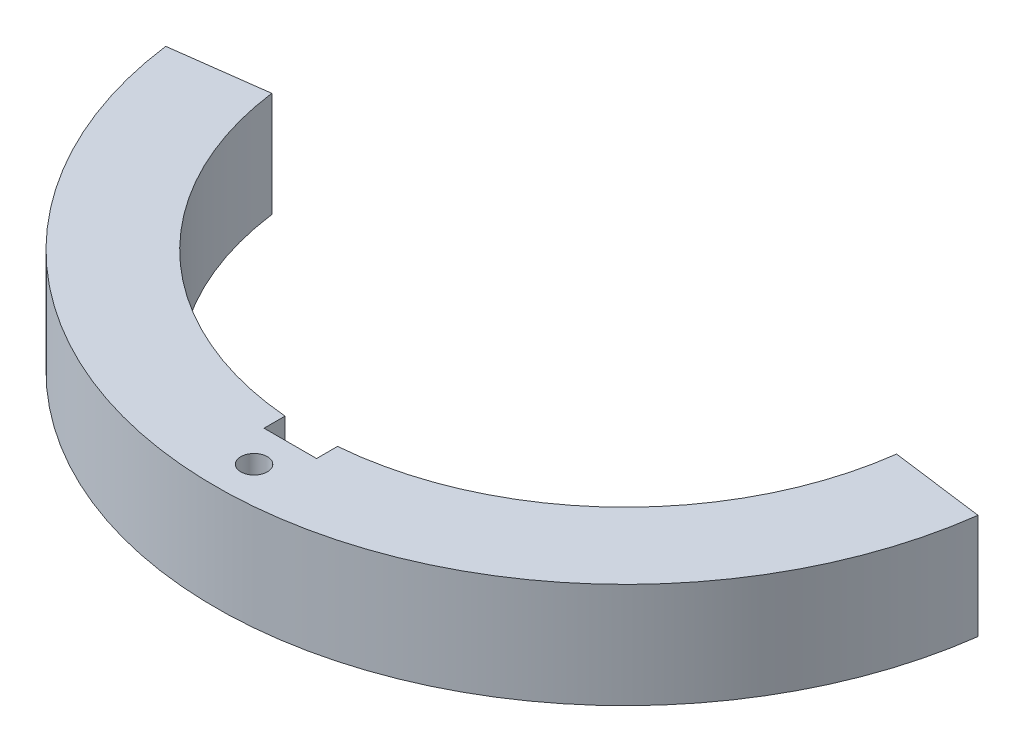
ISO-10303-21;
HEADER;
FILE_DESCRIPTION(('STEP AP214'),'2;1');
FILE_NAME('part.step','',(''),(''),'','','');
FILE_SCHEMA(('AUTOMOTIVE_DESIGN { 1 0 10303 214 1 1 1 1 }'));
ENDSEC;
DATA;
#1=APPLICATION_CONTEXT('core data for automotive mechanical design processes');
#2=APPLICATION_PROTOCOL_DEFINITION('international standard','automotive_design',2000,#1);
#3=PRODUCT_CONTEXT('',#1,'mechanical');
#4=PRODUCT('Part','Part','',(#3));
#5=PRODUCT_RELATED_PRODUCT_CATEGORY('part','',(#4));
#6=PRODUCT_DEFINITION_FORMATION('','',#4);
#7=PRODUCT_DEFINITION_CONTEXT('part definition',#1,'design');
#8=PRODUCT_DEFINITION('design','',#6,#7);
#9=PRODUCT_DEFINITION_SHAPE('','',#8);
#10=(LENGTH_UNIT() NAMED_UNIT(*) SI_UNIT(.MILLI.,.METRE.));
#11=(NAMED_UNIT(*) PLANE_ANGLE_UNIT() SI_UNIT($,.RADIAN.));
#12=(NAMED_UNIT(*) SI_UNIT($,.STERADIAN.) SOLID_ANGLE_UNIT());
#13=UNCERTAINTY_MEASURE_WITH_UNIT(LENGTH_MEASURE(1.E-05),#10,'distance_accuracy_value','');
#14=(GEOMETRIC_REPRESENTATION_CONTEXT(3) GLOBAL_UNCERTAINTY_ASSIGNED_CONTEXT((#13)) GLOBAL_UNIT_ASSIGNED_CONTEXT((#10,
#11,#12)) REPRESENTATION_CONTEXT('',''));
#15=CARTESIAN_POINT('',(0.,0.,0.));
#16=DIRECTION('',(0.,0.,1.));
#17=DIRECTION('',(1.,0.,0.));
#18=AXIS2_PLACEMENT_3D('',#15,#16,#17);
#19=CARTESIAN_POINT('',(0.,12.7,0.));
#20=DIRECTION('',(0.,1.,0.));
#21=DIRECTION('',(0.,0.,1.));
#22=AXIS2_PLACEMENT_3D('',#19,#20,#21);
#23=PLANE('',#22);
#24=CARTESIAN_POINT('',(0.,12.7,44.8850107430872));
#25=DIRECTION('',(0.,1.,0.));
#26=DIRECTION('',(0.,0.,1.));
#27=AXIS2_PLACEMENT_3D('',#24,#25,#26);
#28=CIRCLE('',#27,1.6);
#29=CARTESIAN_POINT('',(0.,12.7,46.4850107430871));
#30=VERTEX_POINT('',#29);
#31=EDGE_CURVE('E196',#30,#30,#28,.T.);
#32=ORIENTED_EDGE('',*,*,#31,.F.);
#33=EDGE_LOOP('',(#32));
#34=FACE_BOUND('',#33,.T.);
#35=DIRECTION('',(0.,0.,-1.));
#36=VECTOR('',#35,1.);
#37=CARTESIAN_POINT('',(3.175,12.7,40.5074778593469));
#38=LINE('',#37,#36);
#39=CARTESIAN_POINT('',(3.175,12.7,40.5074778593469));
#40=VERTEX_POINT('',#39);
#41=CARTESIAN_POINT('',(3.175,12.7,37.9674778593469));
#42=VERTEX_POINT('',#41);
#43=EDGE_CURVE('E144',#40,#42,#38,.T.);
#44=ORIENTED_EDGE('',*,*,#43,.F.);
#45=DIRECTION('',(1.,0.,0.));
#46=VECTOR('',#45,1.);
#47=CARTESIAN_POINT('',(3.175,12.7,40.5074778593469));
#48=LINE('',#47,#46);
#49=CARTESIAN_POINT('',(-3.175,12.7,40.5074778593469));
#50=VERTEX_POINT('',#49);
#51=EDGE_CURVE('E169',#50,#40,#48,.T.);
#52=ORIENTED_EDGE('',*,*,#51,.F.);
#53=DIRECTION('',(0.,0.,-1.));
#54=VECTOR('',#53,1.);
#55=CARTESIAN_POINT('',(-3.175,12.7,40.5074778593469));
#56=LINE('',#55,#54);
#57=CARTESIAN_POINT('',(-3.175,12.7,37.9674778593469));
#58=VERTEX_POINT('',#57);
#59=EDGE_CURVE('E166',#50,#58,#56,.T.);
#60=ORIENTED_EDGE('',*,*,#59,.T.);
#61=CARTESIAN_POINT('',(0.,12.7,0.));
#62=DIRECTION('',(0.,1.,0.));
#63=DIRECTION('',(0.,0.,1.));
#64=AXIS2_PLACEMENT_3D('',#61,#62,#63);
#65=CIRCLE('',#64,38.1);
#66=CARTESIAN_POINT('',(-37.7740492183422,12.7,4.97304792358401));
#67=VERTEX_POINT('',#66);
#68=EDGE_CURVE('E133',#67,#58,#65,.T.);
#69=ORIENTED_EDGE('',*,*,#68,.F.);
#70=DIRECTION('',(-0.99144486137381,0.,0.130526192220053));
#71=VECTOR('',#70,1.);
#72=CARTESIAN_POINT('',(0.,12.7,0.));
#73=LINE('',#72,#71);
#74=CARTESIAN_POINT('',(-49.1062639838448,12.7,6.46496230065921));
#75=VERTEX_POINT('',#74);
#76=EDGE_CURVE('E128',#67,#75,#73,.T.);
#77=ORIENTED_EDGE('',*,*,#76,.T.);
#78=CARTESIAN_POINT('',(0.,12.7,0.));
#79=DIRECTION('',(0.,1.,0.));
#80=DIRECTION('',(0.,0.,1.));
#81=AXIS2_PLACEMENT_3D('',#78,#79,#80);
#82=CIRCLE('',#81,49.53);
#83=CARTESIAN_POINT('',(49.1062639838448,12.7,6.46496230065918));
#84=VERTEX_POINT('',#83);
#85=EDGE_CURVE('E122',#75,#84,#82,.T.);
#86=ORIENTED_EDGE('',*,*,#85,.T.);
#87=DIRECTION('',(0.99144486137381,0.,0.130526192220053));
#88=VECTOR('',#87,1.);
#89=CARTESIAN_POINT('',(0.,12.7,0.));
#90=LINE('',#89,#88);
#91=CARTESIAN_POINT('',(37.7740492183422,12.7,4.97304792358398));
#92=VERTEX_POINT('',#91);
#93=EDGE_CURVE('E96',#92,#84,#90,.T.);
#94=ORIENTED_EDGE('',*,*,#93,.F.);
#95=EDGE_CURVE('E106',#42,#92,#65,.T.);
#96=ORIENTED_EDGE('',*,*,#95,.F.);
#97=EDGE_LOOP('',(#44,#52,#60,#69,#77,#86,#94,#96));
#98=FACE_BOUND('',#97,.T.);
#99=ADVANCED_FACE('F39',(#34,#98),#23,.T.);
#100=CARTESIAN_POINT('',(0.,0.,0.));
#101=DIRECTION('',(0.,1.,0.));
#102=DIRECTION('',(0.,0.,1.));
#103=AXIS2_PLACEMENT_3D('',#100,#101,#102);
#104=PLANE('',#103);
#105=DIRECTION('',(-1.,0.,0.));
#106=VECTOR('',#105,1.);
#107=CARTESIAN_POINT('',(3.175,0.,40.5074778593469));
#108=LINE('',#107,#106);
#109=CARTESIAN_POINT('',(3.175,0.,40.5074778593469));
#110=VERTEX_POINT('',#109);
#111=CARTESIAN_POINT('',(-3.175,0.,40.5074778593469));
#112=VERTEX_POINT('',#111);
#113=EDGE_CURVE('E186',#110,#112,#108,.T.);
#114=ORIENTED_EDGE('',*,*,#113,.F.);
#115=DIRECTION('',(0.,0.,-1.));
#116=VECTOR('',#115,1.);
#117=CARTESIAN_POINT('',(3.175,0.,40.5074778593469));
#118=LINE('',#117,#116);
#119=CARTESIAN_POINT('',(3.175,0.,37.9674778593469));
#120=VERTEX_POINT('',#119);
#121=EDGE_CURVE('E114',#110,#120,#118,.T.);
#122=ORIENTED_EDGE('',*,*,#121,.T.);
#123=CARTESIAN_POINT('',(0.,0.,0.));
#124=DIRECTION('',(0.,1.,0.));
#125=DIRECTION('',(0.,0.,1.));
#126=AXIS2_PLACEMENT_3D('',#123,#124,#125);
#127=CIRCLE('',#126,38.1);
#128=CARTESIAN_POINT('',(37.7740492183422,0.,4.97304792358398));
#129=VERTEX_POINT('',#128);
#130=EDGE_CURVE('E43',#120,#129,#127,.T.);
#131=ORIENTED_EDGE('',*,*,#130,.T.);
#132=DIRECTION('',(-0.99144486137381,0.,-0.130526192220053));
#133=VECTOR('',#132,1.);
#134=CARTESIAN_POINT('',(0.,0.,0.));
#135=LINE('',#134,#133);
#136=CARTESIAN_POINT('',(49.1062639838448,0.,6.46496230065918));
#137=VERTEX_POINT('',#136);
#138=EDGE_CURVE('E89',#137,#129,#135,.T.);
#139=ORIENTED_EDGE('',*,*,#138,.F.);
#140=CARTESIAN_POINT('',(0.,0.,0.));
#141=DIRECTION('',(0.,1.,0.));
#142=DIRECTION('',(0.,0.,1.));
#143=AXIS2_PLACEMENT_3D('',#140,#141,#142);
#144=CIRCLE('',#143,49.53);
#145=CARTESIAN_POINT('',(-49.1062639838448,0.,6.46496230065921));
#146=VERTEX_POINT('',#145);
#147=EDGE_CURVE('E140',#146,#137,#144,.T.);
#148=ORIENTED_EDGE('',*,*,#147,.F.);
#149=DIRECTION('',(0.99144486137381,0.,-0.130526192220053));
#150=VECTOR('',#149,1.);
#151=CARTESIAN_POINT('',(-49.1062639838448,0.,6.46496230065921));
#152=LINE('',#151,#150);
#153=CARTESIAN_POINT('',(-37.7740492183422,0.,4.97304792358401));
#154=VERTEX_POINT('',#153);
#155=EDGE_CURVE('E116',#146,#154,#152,.T.);
#156=ORIENTED_EDGE('',*,*,#155,.T.);
#157=CARTESIAN_POINT('',(0.,0.,0.));
#158=DIRECTION('',(0.,-1.,0.));
#159=DIRECTION('',(0.,0.,-1.));
#160=AXIS2_PLACEMENT_3D('',#157,#158,#159);
#161=CIRCLE('',#160,38.1);
#162=CARTESIAN_POINT('',(-3.175,0.,37.9674778593469));
#163=VERTEX_POINT('',#162);
#164=EDGE_CURVE('E117',#154,#163,#161,.F.);
#165=ORIENTED_EDGE('',*,*,#164,.T.);
#166=DIRECTION('',(0.,0.,-1.));
#167=VECTOR('',#166,1.);
#168=CARTESIAN_POINT('',(-3.175,0.,40.5074778593469));
#169=LINE('',#168,#167);
#170=EDGE_CURVE('E57',#112,#163,#169,.T.);
#171=ORIENTED_EDGE('',*,*,#170,.F.);
#172=EDGE_LOOP('',(#114,#122,#131,#139,#148,#156,#165,#171));
#173=FACE_BOUND('',#172,.T.);
#174=ADVANCED_FACE('F112',(#173),#104,.F.);
#175=CARTESIAN_POINT('',(0.,12.7,0.));
#176=DIRECTION('',(0.,-1.,0.));
#177=DIRECTION('',(0.,0.,-1.));
#178=AXIS2_PLACEMENT_3D('',#175,#176,#177);
#179=CYLINDRICAL_SURFACE('',#178,38.1);
#180=ORIENTED_EDGE('',*,*,#95,.T.);
#181=DIRECTION('',(0.,-1.,0.));
#182=VECTOR('',#181,1.);
#183=CARTESIAN_POINT('',(37.7740492183422,12.7,4.97304792358398));
#184=LINE('',#183,#182);
#185=EDGE_CURVE('E87',#92,#129,#184,.T.);
#186=ORIENTED_EDGE('',*,*,#185,.T.);
#187=ORIENTED_EDGE('',*,*,#130,.F.);
#188=DIRECTION('',(0.,-1.,0.));
#189=VECTOR('',#188,1.);
#190=CARTESIAN_POINT('',(3.175,12.7,37.9674778593469));
#191=LINE('',#190,#189);
#192=EDGE_CURVE('E11',#42,#120,#191,.T.);
#193=ORIENTED_EDGE('',*,*,#192,.F.);
#194=EDGE_LOOP('',(#180,#186,#187,#193));
#195=FACE_BOUND('',#194,.T.);
#196=ADVANCED_FACE('F102',(#195),#179,.F.);
#197=CARTESIAN_POINT('',(0.,12.7,0.));
#198=DIRECTION('',(0.,-1.,0.));
#199=DIRECTION('',(0.,0.,-1.));
#200=AXIS2_PLACEMENT_3D('',#197,#198,#199);
#201=CYLINDRICAL_SURFACE('',#200,49.53);
#202=DIRECTION('',(0.,-1.,0.));
#203=VECTOR('',#202,1.);
#204=CARTESIAN_POINT('',(49.1062639838448,12.7,6.46496230065918));
#205=LINE('',#204,#203);
#206=EDGE_CURVE('E49',#84,#137,#205,.T.);
#207=ORIENTED_EDGE('',*,*,#206,.F.);
#208=ORIENTED_EDGE('',*,*,#85,.F.);
#209=DIRECTION('',(0.,-1.,0.));
#210=VECTOR('',#209,1.);
#211=CARTESIAN_POINT('',(-49.1062639838448,12.7,6.46496230065921));
#212=LINE('',#211,#210);
#213=EDGE_CURVE('E108',#75,#146,#212,.T.);
#214=ORIENTED_EDGE('',*,*,#213,.T.);
#215=ORIENTED_EDGE('',*,*,#147,.T.);
#216=EDGE_LOOP('',(#207,#208,#214,#215));
#217=FACE_BOUND('',#216,.T.);
#218=ADVANCED_FACE('F219',(#217),#201,.T.);
#219=DIRECTION('',(0.,-1.,0.));
#220=VECTOR('',#219,1.);
#221=CARTESIAN_POINT('',(-37.7740492183422,12.7,4.97304792358401));
#222=LINE('',#221,#220);
#223=EDGE_CURVE('E97',#67,#154,#222,.T.);
#224=ORIENTED_EDGE('',*,*,#223,.F.);
#225=ORIENTED_EDGE('',*,*,#68,.T.);
#226=DIRECTION('',(0.,-1.,0.));
#227=VECTOR('',#226,1.);
#228=CARTESIAN_POINT('',(-3.175,12.7,37.9674778593469));
#229=LINE('',#228,#227);
#230=EDGE_CURVE('E131',#58,#163,#229,.T.);
#231=ORIENTED_EDGE('',*,*,#230,.T.);
#232=ORIENTED_EDGE('',*,*,#164,.F.);
#233=EDGE_LOOP('',(#224,#225,#231,#232));
#234=FACE_BOUND('',#233,.T.);
#235=ADVANCED_FACE('F41',(#234),#179,.F.);
#236=CARTESIAN_POINT('',(0.,12.7,0.));
#237=DIRECTION('',(0.130526192220053,0.,0.99144486137381));
#238=DIRECTION('',(0.99144486137381,0.,-0.130526192220053));
#239=AXIS2_PLACEMENT_3D('',#236,#237,#238);
#240=PLANE('',#239);
#241=ORIENTED_EDGE('',*,*,#213,.F.);
#242=ORIENTED_EDGE('',*,*,#76,.F.);
#243=ORIENTED_EDGE('',*,*,#223,.T.);
#244=ORIENTED_EDGE('',*,*,#155,.F.);
#245=EDGE_LOOP('',(#241,#242,#243,#244));
#246=FACE_BOUND('',#245,.T.);
#247=ADVANCED_FACE('F225',(#246),#240,.F.);
#248=CARTESIAN_POINT('',(0.,12.7,0.));
#249=DIRECTION('',(0.130526192220053,0.,-0.99144486137381));
#250=DIRECTION('',(-0.99144486137381,0.,-0.130526192220053));
#251=AXIS2_PLACEMENT_3D('',#248,#249,#250);
#252=PLANE('',#251);
#253=ORIENTED_EDGE('',*,*,#138,.T.);
#254=ORIENTED_EDGE('',*,*,#185,.F.);
#255=ORIENTED_EDGE('',*,*,#93,.T.);
#256=ORIENTED_EDGE('',*,*,#206,.T.);
#257=EDGE_LOOP('',(#253,#254,#255,#256));
#258=FACE_BOUND('',#257,.T.);
#259=ADVANCED_FACE('F90',(#258),#252,.T.);
#260=CARTESIAN_POINT('',(3.175,0.,40.5074778593469));
#261=DIRECTION('',(1.,0.,0.));
#262=DIRECTION('',(0.,0.,-1.));
#263=AXIS2_PLACEMENT_3D('',#260,#261,#262);
#264=PLANE('',#263);
#265=ORIENTED_EDGE('',*,*,#192,.T.);
#266=ORIENTED_EDGE('',*,*,#121,.F.);
#267=DIRECTION('',(0.,-1.,0.));
#268=VECTOR('',#267,1.);
#269=CARTESIAN_POINT('',(3.175,0.,40.5074778593469));
#270=LINE('',#269,#268);
#271=EDGE_CURVE('E192',#40,#110,#270,.T.);
#272=ORIENTED_EDGE('',*,*,#271,.F.);
#273=ORIENTED_EDGE('',*,*,#43,.T.);
#274=EDGE_LOOP('',(#265,#266,#272,#273));
#275=FACE_BOUND('',#274,.T.);
#276=ADVANCED_FACE('F224',(#275),#264,.F.);
#277=CARTESIAN_POINT('',(-3.175,0.,40.5074778593469));
#278=DIRECTION('',(-1.,0.,0.));
#279=DIRECTION('',(0.,0.,1.));
#280=AXIS2_PLACEMENT_3D('',#277,#278,#279);
#281=PLANE('',#280);
#282=ORIENTED_EDGE('',*,*,#230,.F.);
#283=ORIENTED_EDGE('',*,*,#59,.F.);
#284=DIRECTION('',(0.,1.,0.));
#285=VECTOR('',#284,1.);
#286=CARTESIAN_POINT('',(-3.175,0.,40.5074778593469));
#287=LINE('',#286,#285);
#288=EDGE_CURVE('E182',#112,#50,#287,.T.);
#289=ORIENTED_EDGE('',*,*,#288,.F.);
#290=ORIENTED_EDGE('',*,*,#170,.T.);
#291=EDGE_LOOP('',(#282,#283,#289,#290));
#292=FACE_BOUND('',#291,.T.);
#293=ADVANCED_FACE('F231',(#292),#281,.F.);
#294=CARTESIAN_POINT('',(0.,0.,40.5074778593469));
#295=DIRECTION('',(0.,0.,1.));
#296=DIRECTION('',(1.,0.,0.));
#297=AXIS2_PLACEMENT_3D('',#294,#295,#296);
#298=PLANE('',#297);
#299=ORIENTED_EDGE('',*,*,#271,.T.);
#300=ORIENTED_EDGE('',*,*,#113,.T.);
#301=ORIENTED_EDGE('',*,*,#288,.T.);
#302=ORIENTED_EDGE('',*,*,#51,.T.);
#303=EDGE_LOOP('',(#299,#300,#301,#302));
#304=FACE_BOUND('',#303,.T.);
#305=ADVANCED_FACE('F209',(#304),#298,.F.);
#306=CARTESIAN_POINT('',(0.,7.62,44.8850107430872));
#307=DIRECTION('',(0.,1.,0.));
#308=DIRECTION('',(0.,0.,1.));
#309=AXIS2_PLACEMENT_3D('',#306,#307,#308);
#310=CYLINDRICAL_SURFACE('',#309,1.6);
#311=CARTESIAN_POINT('',(0.,7.62,44.8850107430872));
#312=DIRECTION('',(0.,1.,0.));
#313=DIRECTION('',(0.,0.,1.));
#314=AXIS2_PLACEMENT_3D('',#311,#312,#313);
#315=CIRCLE('',#314,1.6);
#316=CARTESIAN_POINT('',(0.,7.62,46.4850107430871));
#317=VERTEX_POINT('',#316);
#318=EDGE_CURVE('E195',#317,#317,#315,.T.);
#319=ORIENTED_EDGE('',*,*,#318,.F.);
#320=EDGE_LOOP('',(#319));
#321=FACE_BOUND('',#320,.T.);
#322=ORIENTED_EDGE('',*,*,#31,.T.);
#323=EDGE_LOOP('',(#322));
#324=FACE_BOUND('',#323,.T.);
#325=ADVANCED_FACE('F206',(#321,#324),#310,.F.);
#326=CARTESIAN_POINT('',(0.,7.62,44.8850107430872));
#327=DIRECTION('',(0.,1.,0.));
#328=DIRECTION('',(0.,0.,1.));
#329=AXIS2_PLACEMENT_3D('',#326,#327,#328);
#330=PLANE('',#329);
#331=ORIENTED_EDGE('',*,*,#318,.T.);
#332=EDGE_LOOP('',(#331));
#333=FACE_BOUND('',#332,.T.);
#334=ADVANCED_FACE('F204',(#333),#330,.T.);
#335=CLOSED_SHELL('',(#99,#174,#196,#218,#235,#247,#259,#276,#293,#305,#325,#334));
#336=MANIFOLD_SOLID_BREP('B2',#335);
#337=ADVANCED_BREP_SHAPE_REPRESENTATION('',(#18,#336),#14);
#338=SHAPE_DEFINITION_REPRESENTATION(#9,#337);
ENDSEC;
END-ISO-10303-21;
